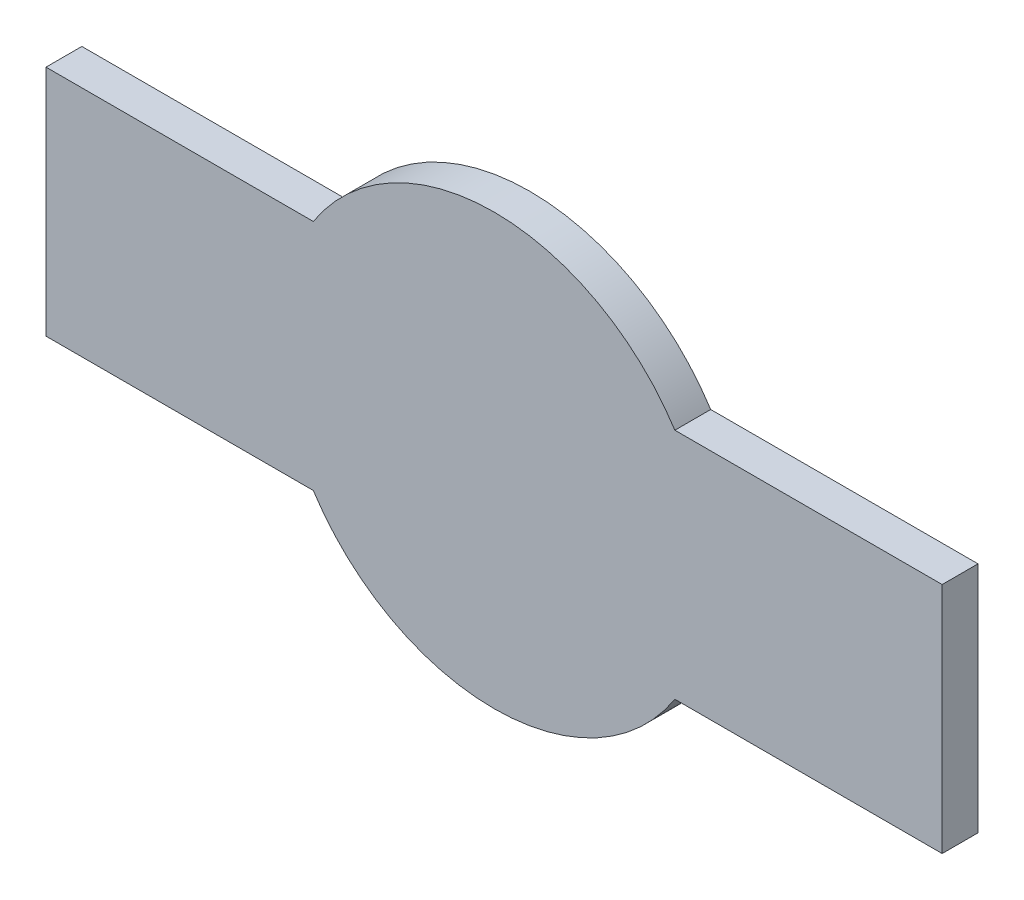
ISO-10303-21;
HEADER;
FILE_DESCRIPTION(('STEP AP214'),'2;1');
FILE_NAME('part.step','',(''),(''),'','','');
FILE_SCHEMA(('AUTOMOTIVE_DESIGN { 1 0 10303 214 1 1 1 1 }'));
ENDSEC;
DATA;
#1=APPLICATION_CONTEXT('core data for automotive mechanical design processes');
#2=APPLICATION_PROTOCOL_DEFINITION('international standard','automotive_design',2000,#1);
#3=PRODUCT_CONTEXT('',#1,'mechanical');
#4=PRODUCT('Part','Part','',(#3));
#5=PRODUCT_RELATED_PRODUCT_CATEGORY('part','',(#4));
#6=PRODUCT_DEFINITION_FORMATION('','',#4);
#7=PRODUCT_DEFINITION_CONTEXT('part definition',#1,'design');
#8=PRODUCT_DEFINITION('design','',#6,#7);
#9=PRODUCT_DEFINITION_SHAPE('','',#8);
#10=(LENGTH_UNIT() NAMED_UNIT(*) SI_UNIT(.MILLI.,.METRE.));
#11=(NAMED_UNIT(*) PLANE_ANGLE_UNIT() SI_UNIT($,.RADIAN.));
#12=(NAMED_UNIT(*) SI_UNIT($,.STERADIAN.) SOLID_ANGLE_UNIT());
#13=UNCERTAINTY_MEASURE_WITH_UNIT(LENGTH_MEASURE(1.E-05),#10,'distance_accuracy_value','');
#14=(GEOMETRIC_REPRESENTATION_CONTEXT(3) GLOBAL_UNCERTAINTY_ASSIGNED_CONTEXT((#13)) GLOBAL_UNIT_ASSIGNED_CONTEXT((#10,
#11,#12)) REPRESENTATION_CONTEXT('',''));
#15=CARTESIAN_POINT('',(0.,0.,0.));
#16=DIRECTION('',(0.,0.,1.));
#17=DIRECTION('',(1.,0.,0.));
#18=AXIS2_PLACEMENT_3D('',#15,#16,#17);
#19=CARTESIAN_POINT('',(0.,0.,10.));
#20=DIRECTION('',(0.,0.,-1.));
#21=DIRECTION('',(-1.,0.,0.));
#22=AXIS2_PLACEMENT_3D('',#19,#20,#21);
#23=CYLINDRICAL_SURFACE('',#22,60.);
#24=DIRECTION('',(0.,0.,-1.));
#25=VECTOR('',#24,1.);
#26=CARTESIAN_POINT('',(50.43560250458,-32.5,10.));
#27=LINE('',#26,#25);
#28=CARTESIAN_POINT('',(50.43560250458,-32.5,10.));
#29=VERTEX_POINT('',#28);
#30=CARTESIAN_POINT('',(50.43560250458,-32.5,0.));
#31=VERTEX_POINT('',#30);
#32=EDGE_CURVE('E72',#29,#31,#27,.T.);
#33=ORIENTED_EDGE('',*,*,#32,.F.);
#34=CARTESIAN_POINT('',(0.,0.,10.));
#35=DIRECTION('',(0.,0.,1.));
#36=DIRECTION('',(1.,0.,0.));
#37=AXIS2_PLACEMENT_3D('',#34,#35,#36);
#38=CIRCLE('',#37,60.);
#39=CARTESIAN_POINT('',(-50.43560250458,-32.5,10.));
#40=VERTEX_POINT('',#39);
#41=EDGE_CURVE('E177',#40,#29,#38,.T.);
#42=ORIENTED_EDGE('',*,*,#41,.F.);
#43=DIRECTION('',(0.,0.,-1.));
#44=VECTOR('',#43,1.);
#45=CARTESIAN_POINT('',(-50.43560250458,-32.5,10.));
#46=LINE('',#45,#44);
#47=CARTESIAN_POINT('',(-50.43560250458,-32.5,0.));
#48=VERTEX_POINT('',#47);
#49=EDGE_CURVE('E158',#48,#40,#46,.F.);
#50=ORIENTED_EDGE('',*,*,#49,.F.);
#51=CARTESIAN_POINT('',(0.,0.,0.));
#52=DIRECTION('',(0.,0.,1.));
#53=DIRECTION('',(1.,0.,0.));
#54=AXIS2_PLACEMENT_3D('',#51,#52,#53);
#55=CIRCLE('',#54,60.);
#56=EDGE_CURVE('E119',#48,#31,#55,.T.);
#57=ORIENTED_EDGE('',*,*,#56,.T.);
#58=EDGE_LOOP('',(#33,#42,#50,#57));
#59=FACE_BOUND('',#58,.T.);
#60=ADVANCED_FACE('F54',(#59),#23,.T.);
#61=CARTESIAN_POINT('',(50.43560250458,32.5,10.));
#62=VERTEX_POINT('',#61);
#63=CARTESIAN_POINT('',(-50.43560250458,32.5,10.));
#64=VERTEX_POINT('',#63);
#65=EDGE_CURVE('E161',#62,#64,#38,.T.);
#66=ORIENTED_EDGE('',*,*,#65,.F.);
#67=DIRECTION('',(0.,0.,-1.));
#68=VECTOR('',#67,1.);
#69=CARTESIAN_POINT('',(50.43560250458,32.5,10.));
#70=LINE('',#69,#68);
#71=CARTESIAN_POINT('',(50.43560250458,32.5,0.));
#72=VERTEX_POINT('',#71);
#73=EDGE_CURVE('E12',#62,#72,#70,.T.);
#74=ORIENTED_EDGE('',*,*,#73,.T.);
#75=CARTESIAN_POINT('',(-50.43560250458,32.5,0.));
#76=VERTEX_POINT('',#75);
#77=EDGE_CURVE('E169',#72,#76,#55,.T.);
#78=ORIENTED_EDGE('',*,*,#77,.T.);
#79=DIRECTION('',(0.,0.,-1.));
#80=VECTOR('',#79,1.);
#81=CARTESIAN_POINT('',(-50.43560250458,32.5,10.));
#82=LINE('',#81,#80);
#83=EDGE_CURVE('E64',#76,#64,#82,.F.);
#84=ORIENTED_EDGE('',*,*,#83,.T.);
#85=EDGE_LOOP('',(#66,#74,#78,#84));
#86=FACE_BOUND('',#85,.T.);
#87=ADVANCED_FACE('F166',(#86),#23,.T.);
#88=CARTESIAN_POINT('',(0.,0.,0.));
#89=DIRECTION('',(0.,0.,1.));
#90=DIRECTION('',(1.,0.,0.));
#91=AXIS2_PLACEMENT_3D('',#88,#89,#90);
#92=PLANE('',#91);
#93=ORIENTED_EDGE('',*,*,#77,.F.);
#94=DIRECTION('',(1.,0.,0.));
#95=VECTOR('',#94,1.);
#96=CARTESIAN_POINT('',(-125.,32.5,0.));
#97=LINE('',#96,#95);
#98=CARTESIAN_POINT('',(125.,32.5,0.));
#99=VERTEX_POINT('',#98);
#100=EDGE_CURVE('E132',#72,#99,#97,.T.);
#101=ORIENTED_EDGE('',*,*,#100,.T.);
#102=DIRECTION('',(0.,1.,0.));
#103=VECTOR('',#102,1.);
#104=CARTESIAN_POINT('',(125.,-32.5,0.));
#105=LINE('',#104,#103);
#106=CARTESIAN_POINT('',(125.,-32.5,0.));
#107=VERTEX_POINT('',#106);
#108=EDGE_CURVE('E131',#107,#99,#105,.T.);
#109=ORIENTED_EDGE('',*,*,#108,.F.);
#110=DIRECTION('',(1.,0.,0.));
#111=VECTOR('',#110,1.);
#112=CARTESIAN_POINT('',(-125.,-32.5,0.));
#113=LINE('',#112,#111);
#114=EDGE_CURVE('E144',#31,#107,#113,.T.);
#115=ORIENTED_EDGE('',*,*,#114,.F.);
#116=ORIENTED_EDGE('',*,*,#56,.F.);
#117=CARTESIAN_POINT('',(-125.,-32.5,0.));
#118=VERTEX_POINT('',#117);
#119=EDGE_CURVE('E136',#118,#48,#113,.T.);
#120=ORIENTED_EDGE('',*,*,#119,.F.);
#121=DIRECTION('',(0.,1.,0.));
#122=VECTOR('',#121,1.);
#123=CARTESIAN_POINT('',(-125.,-32.5,0.));
#124=LINE('',#123,#122);
#125=CARTESIAN_POINT('',(-125.,32.5,0.));
#126=VERTEX_POINT('',#125);
#127=EDGE_CURVE('E112',#118,#126,#124,.T.);
#128=ORIENTED_EDGE('',*,*,#127,.T.);
#129=EDGE_CURVE('E123',#126,#76,#97,.T.);
#130=ORIENTED_EDGE('',*,*,#129,.T.);
#131=EDGE_LOOP('',(#93,#101,#109,#115,#116,#120,#128,#130));
#132=FACE_BOUND('',#131,.T.);
#133=ADVANCED_FACE('F134',(#132),#92,.F.);
#134=CARTESIAN_POINT('',(0.,0.,10.));
#135=DIRECTION('',(0.,0.,1.));
#136=DIRECTION('',(1.,0.,0.));
#137=AXIS2_PLACEMENT_3D('',#134,#135,#136);
#138=PLANE('',#137);
#139=ORIENTED_EDGE('',*,*,#65,.T.);
#140=DIRECTION('',(1.,0.,0.));
#141=VECTOR('',#140,1.);
#142=CARTESIAN_POINT('',(-125.,32.5,10.));
#143=LINE('',#142,#141);
#144=CARTESIAN_POINT('',(-125.,32.5,10.));
#145=VERTEX_POINT('',#144);
#146=EDGE_CURVE('E142',#145,#64,#143,.T.);
#147=ORIENTED_EDGE('',*,*,#146,.F.);
#148=DIRECTION('',(0.,1.,0.));
#149=VECTOR('',#148,1.);
#150=CARTESIAN_POINT('',(-125.,-32.5,10.));
#151=LINE('',#150,#149);
#152=CARTESIAN_POINT('',(-125.,-32.5,10.));
#153=VERTEX_POINT('',#152);
#154=EDGE_CURVE('E114',#153,#145,#151,.T.);
#155=ORIENTED_EDGE('',*,*,#154,.F.);
#156=DIRECTION('',(1.,0.,0.));
#157=VECTOR('',#156,1.);
#158=CARTESIAN_POINT('',(-125.,-32.5,10.));
#159=LINE('',#158,#157);
#160=EDGE_CURVE('E187',#153,#40,#159,.T.);
#161=ORIENTED_EDGE('',*,*,#160,.T.);
#162=ORIENTED_EDGE('',*,*,#41,.T.);
#163=CARTESIAN_POINT('',(125.,-32.5,10.));
#164=VERTEX_POINT('',#163);
#165=EDGE_CURVE('E186',#29,#164,#159,.T.);
#166=ORIENTED_EDGE('',*,*,#165,.T.);
#167=DIRECTION('',(0.,1.,0.));
#168=VECTOR('',#167,1.);
#169=CARTESIAN_POINT('',(125.,-32.5,10.));
#170=LINE('',#169,#168);
#171=CARTESIAN_POINT('',(125.,32.5,10.));
#172=VERTEX_POINT('',#171);
#173=EDGE_CURVE('E172',#164,#172,#170,.T.);
#174=ORIENTED_EDGE('',*,*,#173,.T.);
#175=EDGE_CURVE('E138',#62,#172,#143,.T.);
#176=ORIENTED_EDGE('',*,*,#175,.F.);
#177=EDGE_LOOP('',(#139,#147,#155,#161,#162,#166,#174,#176));
#178=FACE_BOUND('',#177,.T.);
#179=ADVANCED_FACE('F174',(#178),#138,.T.);
#180=CARTESIAN_POINT('',(125.,-32.5,10.));
#181=DIRECTION('',(-1.,0.,0.));
#182=DIRECTION('',(0.,0.,1.));
#183=AXIS2_PLACEMENT_3D('',#180,#181,#182);
#184=PLANE('',#183);
#185=ORIENTED_EDGE('',*,*,#108,.T.);
#186=DIRECTION('',(0.,0.,-1.));
#187=VECTOR('',#186,1.);
#188=CARTESIAN_POINT('',(125.,32.5,10.));
#189=LINE('',#188,#187);
#190=EDGE_CURVE('E154',#172,#99,#189,.T.);
#191=ORIENTED_EDGE('',*,*,#190,.F.);
#192=ORIENTED_EDGE('',*,*,#173,.F.);
#193=DIRECTION('',(0.,0.,-1.));
#194=VECTOR('',#193,1.);
#195=CARTESIAN_POINT('',(125.,-32.5,10.));
#196=LINE('',#195,#194);
#197=EDGE_CURVE('E150',#164,#107,#196,.T.);
#198=ORIENTED_EDGE('',*,*,#197,.T.);
#199=EDGE_LOOP('',(#185,#191,#192,#198));
#200=FACE_BOUND('',#199,.T.);
#201=ADVANCED_FACE('F204',(#200),#184,.F.);
#202=CARTESIAN_POINT('',(-125.,32.5,10.));
#203=DIRECTION('',(0.,1.,0.));
#204=DIRECTION('',(0.,0.,1.));
#205=AXIS2_PLACEMENT_3D('',#202,#203,#204);
#206=PLANE('',#205);
#207=ORIENTED_EDGE('',*,*,#73,.F.);
#208=ORIENTED_EDGE('',*,*,#175,.T.);
#209=ORIENTED_EDGE('',*,*,#190,.T.);
#210=ORIENTED_EDGE('',*,*,#100,.F.);
#211=EDGE_LOOP('',(#207,#208,#209,#210));
#212=FACE_BOUND('',#211,.T.);
#213=ADVANCED_FACE('F56',(#212),#206,.T.);
#214=CARTESIAN_POINT('',(-125.,-32.5,10.));
#215=DIRECTION('',(0.,1.,0.));
#216=DIRECTION('',(0.,0.,1.));
#217=AXIS2_PLACEMENT_3D('',#214,#215,#216);
#218=PLANE('',#217);
#219=ORIENTED_EDGE('',*,*,#165,.F.);
#220=ORIENTED_EDGE('',*,*,#32,.T.);
#221=ORIENTED_EDGE('',*,*,#114,.T.);
#222=ORIENTED_EDGE('',*,*,#197,.F.);
#223=EDGE_LOOP('',(#219,#220,#221,#222));
#224=FACE_BOUND('',#223,.T.);
#225=ADVANCED_FACE('F201',(#224),#218,.F.);
#226=CARTESIAN_POINT('',(-125.,-32.5,10.));
#227=DIRECTION('',(-1.,0.,0.));
#228=DIRECTION('',(0.,0.,1.));
#229=AXIS2_PLACEMENT_3D('',#226,#227,#228);
#230=PLANE('',#229);
#231=ORIENTED_EDGE('',*,*,#127,.F.);
#232=DIRECTION('',(0.,0.,-1.));
#233=VECTOR('',#232,1.);
#234=CARTESIAN_POINT('',(-125.,-32.5,10.));
#235=LINE('',#234,#233);
#236=EDGE_CURVE('E102',#153,#118,#235,.T.);
#237=ORIENTED_EDGE('',*,*,#236,.F.);
#238=ORIENTED_EDGE('',*,*,#154,.T.);
#239=DIRECTION('',(0.,0.,-1.));
#240=VECTOR('',#239,1.);
#241=CARTESIAN_POINT('',(-125.,32.5,10.));
#242=LINE('',#241,#240);
#243=EDGE_CURVE('E108',#145,#126,#242,.T.);
#244=ORIENTED_EDGE('',*,*,#243,.T.);
#245=EDGE_LOOP('',(#231,#237,#238,#244));
#246=FACE_BOUND('',#245,.T.);
#247=ADVANCED_FACE('F110',(#246),#230,.T.);
#248=ORIENTED_EDGE('',*,*,#119,.T.);
#249=ORIENTED_EDGE('',*,*,#49,.T.);
#250=ORIENTED_EDGE('',*,*,#160,.F.);
#251=ORIENTED_EDGE('',*,*,#236,.T.);
#252=EDGE_LOOP('',(#248,#249,#250,#251));
#253=FACE_BOUND('',#252,.T.);
#254=ADVANCED_FACE('F218',(#253),#218,.F.);
#255=ORIENTED_EDGE('',*,*,#83,.F.);
#256=ORIENTED_EDGE('',*,*,#129,.F.);
#257=ORIENTED_EDGE('',*,*,#243,.F.);
#258=ORIENTED_EDGE('',*,*,#146,.T.);
#259=EDGE_LOOP('',(#255,#256,#257,#258));
#260=FACE_BOUND('',#259,.T.);
#261=ADVANCED_FACE('F124',(#260),#206,.T.);
#262=CLOSED_SHELL('',(#60,#87,#133,#179,#201,#213,#225,#247,#254,#261));
#263=MANIFOLD_SOLID_BREP('B2',#262);
#264=ADVANCED_BREP_SHAPE_REPRESENTATION('',(#18,#263),#14);
#265=SHAPE_DEFINITION_REPRESENTATION(#9,#264);
ENDSEC;
END-ISO-10303-21;
